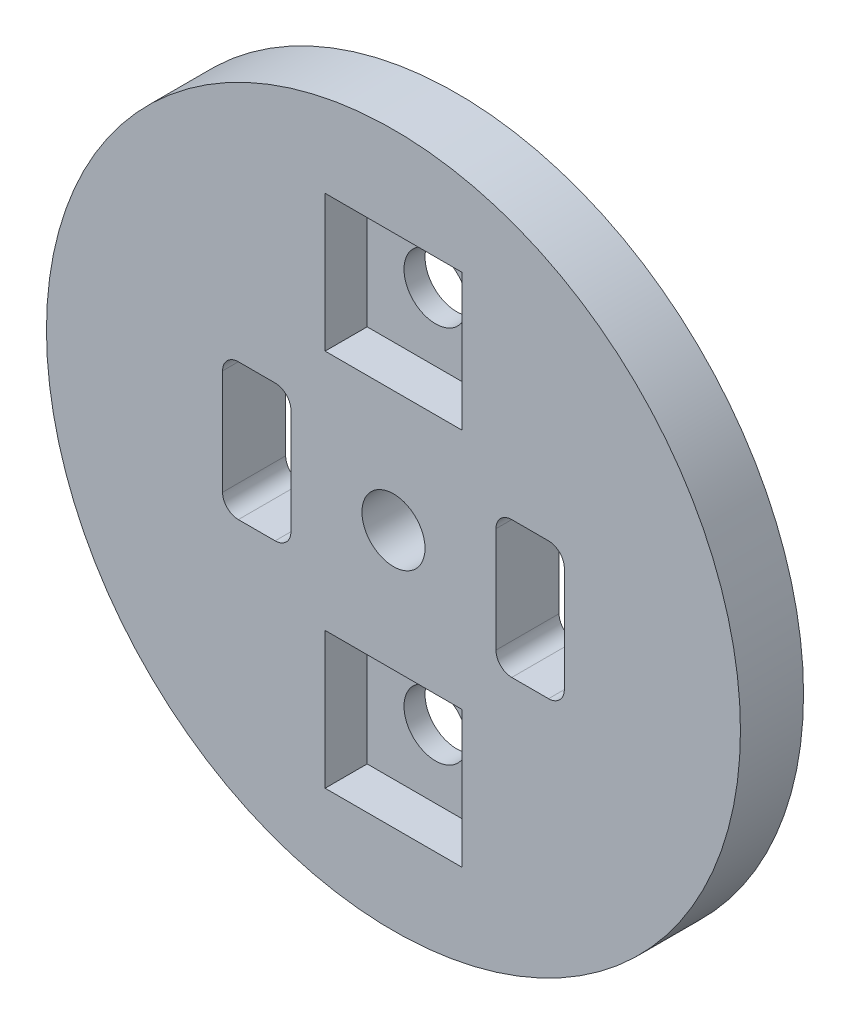
ISO-10303-21;
HEADER;
FILE_DESCRIPTION(('STEP AP214'),'2;1');
FILE_NAME('part.step','',(''),(''),'','','');
FILE_SCHEMA(('AUTOMOTIVE_DESIGN { 1 0 10303 214 1 1 1 1 }'));
ENDSEC;
DATA;
#1=APPLICATION_CONTEXT('core data for automotive mechanical design processes');
#2=APPLICATION_PROTOCOL_DEFINITION('international standard','automotive_design',2000,#1);
#3=PRODUCT_CONTEXT('',#1,'mechanical');
#4=PRODUCT('Part','Part','',(#3));
#5=PRODUCT_RELATED_PRODUCT_CATEGORY('part','',(#4));
#6=PRODUCT_DEFINITION_FORMATION('','',#4);
#7=PRODUCT_DEFINITION_CONTEXT('part definition',#1,'design');
#8=PRODUCT_DEFINITION('design','',#6,#7);
#9=PRODUCT_DEFINITION_SHAPE('','',#8);
#10=(LENGTH_UNIT() NAMED_UNIT(*) SI_UNIT(.MILLI.,.METRE.));
#11=(NAMED_UNIT(*) PLANE_ANGLE_UNIT() SI_UNIT($,.RADIAN.));
#12=(NAMED_UNIT(*) SI_UNIT($,.STERADIAN.) SOLID_ANGLE_UNIT());
#13=UNCERTAINTY_MEASURE_WITH_UNIT(LENGTH_MEASURE(1.E-05),#10,'distance_accuracy_value','');
#14=(GEOMETRIC_REPRESENTATION_CONTEXT(3) GLOBAL_UNCERTAINTY_ASSIGNED_CONTEXT((#13)) GLOBAL_UNIT_ASSIGNED_CONTEXT((#10,
#11,#12)) REPRESENTATION_CONTEXT('',''));
#15=CARTESIAN_POINT('',(0.,0.,0.));
#16=DIRECTION('',(0.,0.,1.));
#17=DIRECTION('',(1.,0.,0.));
#18=AXIS2_PLACEMENT_3D('',#15,#16,#17);
#19=CARTESIAN_POINT('',(215.7478079135,232.9520199932,3.));
#20=DIRECTION('',(0.,0.,-1.));
#21=DIRECTION('',(-1.,0.,0.));
#22=AXIS2_PLACEMENT_3D('',#19,#20,#21);
#23=CYLINDRICAL_SURFACE('',#22,1.5);
#24=CARTESIAN_POINT('',(215.7478079135,232.9520199932,0.));
#25=DIRECTION('',(0.,0.,1.));
#26=DIRECTION('',(1.,0.,0.));
#27=AXIS2_PLACEMENT_3D('',#24,#25,#26);
#28=CIRCLE('',#27,1.5);
#29=CARTESIAN_POINT('',(217.2478079135,232.9520199932,0.));
#30=VERTEX_POINT('',#29);
#31=EDGE_CURVE('E355',#30,#30,#28,.T.);
#32=ORIENTED_EDGE('',*,*,#31,.F.);
#33=EDGE_LOOP('',(#32));
#34=FACE_BOUND('',#33,.T.);
#35=CARTESIAN_POINT('',(215.7478079135,232.9520199932,1.));
#36=DIRECTION('',(0.,0.,1.));
#37=DIRECTION('',(1.,0.,0.));
#38=AXIS2_PLACEMENT_3D('',#35,#36,#37);
#39=CIRCLE('',#38,1.5);
#40=CARTESIAN_POINT('',(217.2478079135,232.9520199932,1.));
#41=VERTEX_POINT('',#40);
#42=EDGE_CURVE('E72',#41,#41,#39,.T.);
#43=ORIENTED_EDGE('',*,*,#42,.T.);
#44=EDGE_LOOP('',(#43));
#45=FACE_BOUND('',#44,.T.);
#46=ADVANCED_FACE('F69',(#34,#45),#23,.F.);
#47=CARTESIAN_POINT('',(215.7478079135,250.9520199932,3.));
#48=DIRECTION('',(0.,0.,-1.));
#49=DIRECTION('',(-1.,0.,0.));
#50=AXIS2_PLACEMENT_3D('',#47,#48,#49);
#51=CYLINDRICAL_SURFACE('',#50,1.5);
#52=CARTESIAN_POINT('',(215.7478079135,250.9520199932,0.));
#53=DIRECTION('',(0.,0.,1.));
#54=DIRECTION('',(1.,0.,0.));
#55=AXIS2_PLACEMENT_3D('',#52,#53,#54);
#56=CIRCLE('',#55,1.5);
#57=CARTESIAN_POINT('',(217.2478079135,250.9520199932,0.));
#58=VERTEX_POINT('',#57);
#59=EDGE_CURVE('E303',#58,#58,#56,.T.);
#60=ORIENTED_EDGE('',*,*,#59,.F.);
#61=EDGE_LOOP('',(#60));
#62=FACE_BOUND('',#61,.T.);
#63=CARTESIAN_POINT('',(215.7478079135,250.9520199932,1.));
#64=DIRECTION('',(0.,0.,1.));
#65=DIRECTION('',(1.,0.,0.));
#66=AXIS2_PLACEMENT_3D('',#63,#64,#65);
#67=CIRCLE('',#66,1.5);
#68=CARTESIAN_POINT('',(217.2478079135,250.9520199932,1.));
#69=VERTEX_POINT('',#68);
#70=EDGE_CURVE('E293',#69,#69,#67,.T.);
#71=ORIENTED_EDGE('',*,*,#70,.T.);
#72=EDGE_LOOP('',(#71));
#73=FACE_BOUND('',#72,.T.);
#74=ADVANCED_FACE('F440',(#62,#73),#51,.F.);
#75=CARTESIAN_POINT('',(215.7478079135,241.9520199932,3.));
#76=DIRECTION('',(0.,0.,-1.));
#77=DIRECTION('',(-1.,0.,0.));
#78=AXIS2_PLACEMENT_3D('',#75,#76,#77);
#79=CYLINDRICAL_SURFACE('',#78,16.5);
#80=CARTESIAN_POINT('',(215.7478079135,241.9520199932,3.));
#81=DIRECTION('',(0.,0.,1.));
#82=DIRECTION('',(1.,0.,0.));
#83=AXIS2_PLACEMENT_3D('',#80,#81,#82);
#84=CIRCLE('',#83,16.5);
#85=CARTESIAN_POINT('',(232.2478079135,241.9520199932,3.));
#86=VERTEX_POINT('',#85);
#87=EDGE_CURVE('E347',#86,#86,#84,.T.);
#88=ORIENTED_EDGE('',*,*,#87,.F.);
#89=EDGE_LOOP('',(#88));
#90=FACE_BOUND('',#89,.T.);
#91=CARTESIAN_POINT('',(215.7478079135,241.9520199932,0.));
#92=DIRECTION('',(0.,0.,1.));
#93=DIRECTION('',(1.,0.,0.));
#94=AXIS2_PLACEMENT_3D('',#91,#92,#93);
#95=CIRCLE('',#94,16.5);
#96=CARTESIAN_POINT('',(232.2478079135,241.9520199932,0.));
#97=VERTEX_POINT('',#96);
#98=EDGE_CURVE('E403',#97,#97,#95,.T.);
#99=ORIENTED_EDGE('',*,*,#98,.T.);
#100=EDGE_LOOP('',(#99));
#101=FACE_BOUND('',#100,.T.);
#102=ADVANCED_FACE('F477',(#90,#101),#79,.T.);
#103=CARTESIAN_POINT('',(0.,238.7020199932,3.));
#104=DIRECTION('',(0.,-1.,0.));
#105=DIRECTION('',(0.,0.,-1.));
#106=AXIS2_PLACEMENT_3D('',#103,#104,#105);
#107=PLANE('',#106);
#108=DIRECTION('',(-1.,0.,0.));
#109=VECTOR('',#108,1.);
#110=CARTESIAN_POINT('',(0.,238.7020199932,0.));
#111=LINE('',#110,#109);
#112=CARTESIAN_POINT('',(210.1228079135,238.7020199932,0.));
#113=VERTEX_POINT('',#112);
#114=CARTESIAN_POINT('',(208.3728079135,238.7020199932,0.));
#115=VERTEX_POINT('',#114);
#116=EDGE_CURVE('E382',#113,#115,#111,.T.);
#117=ORIENTED_EDGE('',*,*,#116,.T.);
#118=DIRECTION('',(0.,0.,-1.));
#119=VECTOR('',#118,1.);
#120=CARTESIAN_POINT('',(208.3728079135,238.7020199932,3.));
#121=LINE('',#120,#119);
#122=CARTESIAN_POINT('',(208.3728079135,238.7020199932,3.));
#123=VERTEX_POINT('',#122);
#124=EDGE_CURVE('E77',#123,#115,#121,.T.);
#125=ORIENTED_EDGE('',*,*,#124,.F.);
#126=DIRECTION('',(-1.,0.,0.));
#127=VECTOR('',#126,1.);
#128=CARTESIAN_POINT('',(0.,238.7020199932,3.));
#129=LINE('',#128,#127);
#130=CARTESIAN_POINT('',(210.1228079135,238.7020199932,3.));
#131=VERTEX_POINT('',#130);
#132=EDGE_CURVE('E330',#131,#123,#129,.T.);
#133=ORIENTED_EDGE('',*,*,#132,.F.);
#134=DIRECTION('',(0.,0.,-1.));
#135=VECTOR('',#134,1.);
#136=CARTESIAN_POINT('',(210.1228079135,238.7020199932,3.));
#137=LINE('',#136,#135);
#138=EDGE_CURVE('E12',#131,#113,#137,.T.);
#139=ORIENTED_EDGE('',*,*,#138,.T.);
#140=EDGE_LOOP('',(#117,#125,#133,#139));
#141=FACE_BOUND('',#140,.T.);
#142=ADVANCED_FACE('F480',(#141),#107,.F.);
#143=CARTESIAN_POINT('',(208.3728079135,239.4520199932,3.));
#144=DIRECTION('',(0.,0.,-1.));
#145=DIRECTION('',(-1.,0.,0.));
#146=AXIS2_PLACEMENT_3D('',#143,#144,#145);
#147=CYLINDRICAL_SURFACE('',#146,0.750000000000237);
#148=CARTESIAN_POINT('',(208.3728079135,239.4520199932,0.));
#149=DIRECTION('',(0.,0.,1.));
#150=DIRECTION('',(1.,0.,0.));
#151=AXIS2_PLACEMENT_3D('',#148,#149,#150);
#152=CIRCLE('',#151,0.750000000000237);
#153=CARTESIAN_POINT('',(207.6228079135,239.4520199932,0.));
#154=VERTEX_POINT('',#153);
#155=EDGE_CURVE('E385',#154,#115,#152,.T.);
#156=ORIENTED_EDGE('',*,*,#155,.F.);
#157=DIRECTION('',(0.,0.,-1.));
#158=VECTOR('',#157,1.);
#159=CARTESIAN_POINT('',(207.6228079135,239.4520199932,3.));
#160=LINE('',#159,#158);
#161=CARTESIAN_POINT('',(207.6228079135,239.4520199932,3.));
#162=VERTEX_POINT('',#161);
#163=EDGE_CURVE('E419',#162,#154,#160,.T.);
#164=ORIENTED_EDGE('',*,*,#163,.F.);
#165=CARTESIAN_POINT('',(208.3728079135,239.4520199932,3.));
#166=DIRECTION('',(0.,0.,1.));
#167=DIRECTION('',(1.,0.,0.));
#168=AXIS2_PLACEMENT_3D('',#165,#166,#167);
#169=CIRCLE('',#168,0.750000000000237);
#170=EDGE_CURVE('E332',#162,#123,#169,.T.);
#171=ORIENTED_EDGE('',*,*,#170,.T.);
#172=ORIENTED_EDGE('',*,*,#124,.T.);
#173=EDGE_LOOP('',(#156,#164,#171,#172));
#174=FACE_BOUND('',#173,.T.);
#175=ADVANCED_FACE('F546',(#174),#147,.F.);
#176=CARTESIAN_POINT('',(207.6228079135,0.,3.));
#177=DIRECTION('',(-1.,0.,0.));
#178=DIRECTION('',(0.,0.,1.));
#179=AXIS2_PLACEMENT_3D('',#176,#177,#178);
#180=PLANE('',#179);
#181=DIRECTION('',(0.,1.,0.));
#182=VECTOR('',#181,1.);
#183=CARTESIAN_POINT('',(207.6228079135,0.,0.));
#184=LINE('',#183,#182);
#185=CARTESIAN_POINT('',(207.6228079135,244.4520199932,0.));
#186=VERTEX_POINT('',#185);
#187=EDGE_CURVE('E388',#154,#186,#184,.T.);
#188=ORIENTED_EDGE('',*,*,#187,.T.);
#189=DIRECTION('',(0.,0.,-1.));
#190=VECTOR('',#189,1.);
#191=CARTESIAN_POINT('',(207.6228079135,244.4520199932,3.));
#192=LINE('',#191,#190);
#193=CARTESIAN_POINT('',(207.6228079135,244.4520199932,3.));
#194=VERTEX_POINT('',#193);
#195=EDGE_CURVE('E417',#194,#186,#192,.T.);
#196=ORIENTED_EDGE('',*,*,#195,.F.);
#197=DIRECTION('',(0.,1.,0.));
#198=VECTOR('',#197,1.);
#199=CARTESIAN_POINT('',(207.6228079135,0.,3.));
#200=LINE('',#199,#198);
#201=EDGE_CURVE('E335',#162,#194,#200,.T.);
#202=ORIENTED_EDGE('',*,*,#201,.F.);
#203=ORIENTED_EDGE('',*,*,#163,.T.);
#204=EDGE_LOOP('',(#188,#196,#202,#203));
#205=FACE_BOUND('',#204,.T.);
#206=ADVANCED_FACE('F542',(#205),#180,.F.);
#207=CARTESIAN_POINT('',(208.3728079135,244.4520199932,3.));
#208=DIRECTION('',(0.,0.,-1.));
#209=DIRECTION('',(-1.,0.,0.));
#210=AXIS2_PLACEMENT_3D('',#207,#208,#209);
#211=CYLINDRICAL_SURFACE('',#210,0.750000000000001);
#212=CARTESIAN_POINT('',(208.3728079135,244.4520199932,0.));
#213=DIRECTION('',(0.,0.,1.));
#214=DIRECTION('',(1.,0.,0.));
#215=AXIS2_PLACEMENT_3D('',#212,#213,#214);
#216=CIRCLE('',#215,0.750000000000001);
#217=CARTESIAN_POINT('',(208.3728079135,245.2020199932,0.));
#218=VERTEX_POINT('',#217);
#219=EDGE_CURVE('E391',#218,#186,#216,.T.);
#220=ORIENTED_EDGE('',*,*,#219,.F.);
#221=DIRECTION('',(0.,0.,-1.));
#222=VECTOR('',#221,1.);
#223=CARTESIAN_POINT('',(208.3728079135,245.2020199932,3.));
#224=LINE('',#223,#222);
#225=CARTESIAN_POINT('',(208.3728079135,245.2020199932,3.));
#226=VERTEX_POINT('',#225);
#227=EDGE_CURVE('E415',#226,#218,#224,.T.);
#228=ORIENTED_EDGE('',*,*,#227,.F.);
#229=CARTESIAN_POINT('',(208.3728079135,244.4520199932,3.));
#230=DIRECTION('',(0.,0.,1.));
#231=DIRECTION('',(1.,0.,0.));
#232=AXIS2_PLACEMENT_3D('',#229,#230,#231);
#233=CIRCLE('',#232,0.750000000000001);
#234=EDGE_CURVE('E337',#226,#194,#233,.T.);
#235=ORIENTED_EDGE('',*,*,#234,.T.);
#236=ORIENTED_EDGE('',*,*,#195,.T.);
#237=EDGE_LOOP('',(#220,#228,#235,#236));
#238=FACE_BOUND('',#237,.T.);
#239=ADVANCED_FACE('F538',(#238),#211,.F.);
#240=CARTESIAN_POINT('',(0.,245.2020199932,3.));
#241=DIRECTION('',(0.,1.,0.));
#242=DIRECTION('',(0.,0.,1.));
#243=AXIS2_PLACEMENT_3D('',#240,#241,#242);
#244=PLANE('',#243);
#245=DIRECTION('',(1.,0.,0.));
#246=VECTOR('',#245,1.);
#247=CARTESIAN_POINT('',(0.,245.2020199932,0.));
#248=LINE('',#247,#246);
#249=CARTESIAN_POINT('',(210.1228079135,245.2020199932,0.));
#250=VERTEX_POINT('',#249);
#251=EDGE_CURVE('E394',#218,#250,#248,.T.);
#252=ORIENTED_EDGE('',*,*,#251,.T.);
#253=DIRECTION('',(0.,0.,-1.));
#254=VECTOR('',#253,1.);
#255=CARTESIAN_POINT('',(210.1228079135,245.2020199932,3.));
#256=LINE('',#255,#254);
#257=CARTESIAN_POINT('',(210.1228079135,245.2020199932,3.));
#258=VERTEX_POINT('',#257);
#259=EDGE_CURVE('E413',#258,#250,#256,.T.);
#260=ORIENTED_EDGE('',*,*,#259,.F.);
#261=DIRECTION('',(1.,0.,0.));
#262=VECTOR('',#261,1.);
#263=CARTESIAN_POINT('',(0.,245.2020199932,3.));
#264=LINE('',#263,#262);
#265=EDGE_CURVE('E340',#226,#258,#264,.T.);
#266=ORIENTED_EDGE('',*,*,#265,.F.);
#267=ORIENTED_EDGE('',*,*,#227,.T.);
#268=EDGE_LOOP('',(#252,#260,#266,#267));
#269=FACE_BOUND('',#268,.T.);
#270=ADVANCED_FACE('F534',(#269),#244,.F.);
#271=CARTESIAN_POINT('',(210.1228079135,244.4520199932,3.));
#272=DIRECTION('',(0.,0.,-1.));
#273=DIRECTION('',(-1.,0.,0.));
#274=AXIS2_PLACEMENT_3D('',#271,#272,#273);
#275=CYLINDRICAL_SURFACE('',#274,0.750000000000001);
#276=CARTESIAN_POINT('',(210.1228079135,244.4520199932,0.));
#277=DIRECTION('',(0.,0.,1.));
#278=DIRECTION('',(1.,0.,0.));
#279=AXIS2_PLACEMENT_3D('',#276,#277,#278);
#280=CIRCLE('',#279,0.750000000000001);
#281=CARTESIAN_POINT('',(210.8728079135,244.4520199932,0.));
#282=VERTEX_POINT('',#281);
#283=EDGE_CURVE('E397',#282,#250,#280,.T.);
#284=ORIENTED_EDGE('',*,*,#283,.F.);
#285=DIRECTION('',(0.,0.,-1.));
#286=VECTOR('',#285,1.);
#287=CARTESIAN_POINT('',(210.8728079135,244.4520199932,3.));
#288=LINE('',#287,#286);
#289=CARTESIAN_POINT('',(210.8728079135,244.4520199932,3.));
#290=VERTEX_POINT('',#289);
#291=EDGE_CURVE('E410',#290,#282,#288,.T.);
#292=ORIENTED_EDGE('',*,*,#291,.F.);
#293=CARTESIAN_POINT('',(210.1228079135,244.4520199932,3.));
#294=DIRECTION('',(0.,0.,1.));
#295=DIRECTION('',(1.,0.,0.));
#296=AXIS2_PLACEMENT_3D('',#293,#294,#295);
#297=CIRCLE('',#296,0.750000000000001);
#298=EDGE_CURVE('E342',#290,#258,#297,.T.);
#299=ORIENTED_EDGE('',*,*,#298,.T.);
#300=ORIENTED_EDGE('',*,*,#259,.T.);
#301=EDGE_LOOP('',(#284,#292,#299,#300));
#302=FACE_BOUND('',#301,.T.);
#303=ADVANCED_FACE('F530',(#302),#275,.F.);
#304=CARTESIAN_POINT('',(210.8728079135,0.,3.));
#305=DIRECTION('',(1.,0.,0.));
#306=DIRECTION('',(0.,0.,-1.));
#307=AXIS2_PLACEMENT_3D('',#304,#305,#306);
#308=PLANE('',#307);
#309=DIRECTION('',(0.,-1.,0.));
#310=VECTOR('',#309,1.);
#311=CARTESIAN_POINT('',(210.8728079135,0.,0.));
#312=LINE('',#311,#310);
#313=CARTESIAN_POINT('',(210.8728079135,239.4520199932,0.));
#314=VERTEX_POINT('',#313);
#315=EDGE_CURVE('E400',#282,#314,#312,.T.);
#316=ORIENTED_EDGE('',*,*,#315,.T.);
#317=DIRECTION('',(0.,0.,-1.));
#318=VECTOR('',#317,1.);
#319=CARTESIAN_POINT('',(210.8728079135,239.4520199932,3.));
#320=LINE('',#319,#318);
#321=CARTESIAN_POINT('',(210.8728079135,239.4520199932,3.));
#322=VERTEX_POINT('',#321);
#323=EDGE_CURVE('E408',#322,#314,#320,.T.);
#324=ORIENTED_EDGE('',*,*,#323,.F.);
#325=DIRECTION('',(0.,-1.,0.));
#326=VECTOR('',#325,1.);
#327=CARTESIAN_POINT('',(210.8728079135,0.,3.));
#328=LINE('',#327,#326);
#329=EDGE_CURVE('E345',#290,#322,#328,.T.);
#330=ORIENTED_EDGE('',*,*,#329,.F.);
#331=ORIENTED_EDGE('',*,*,#291,.T.);
#332=EDGE_LOOP('',(#316,#324,#330,#331));
#333=FACE_BOUND('',#332,.T.);
#334=ADVANCED_FACE('F526',(#333),#308,.F.);
#335=CARTESIAN_POINT('',(210.1228079135,239.4520199932,3.));
#336=DIRECTION('',(0.,0.,-1.));
#337=DIRECTION('',(-1.,0.,0.));
#338=AXIS2_PLACEMENT_3D('',#335,#336,#337);
#339=CYLINDRICAL_SURFACE('',#338,0.750000000000001);
#340=CARTESIAN_POINT('',(210.1228079135,239.4520199932,0.));
#341=DIRECTION('',(0.,0.,1.));
#342=DIRECTION('',(1.,0.,0.));
#343=AXIS2_PLACEMENT_3D('',#340,#341,#342);
#344=CIRCLE('',#343,0.750000000000001);
#345=EDGE_CURVE('E379',#113,#314,#344,.T.);
#346=ORIENTED_EDGE('',*,*,#345,.F.);
#347=ORIENTED_EDGE('',*,*,#138,.F.);
#348=CARTESIAN_POINT('',(210.1228079135,239.4520199932,3.));
#349=DIRECTION('',(0.,0.,1.));
#350=DIRECTION('',(1.,0.,0.));
#351=AXIS2_PLACEMENT_3D('',#348,#349,#350);
#352=CIRCLE('',#351,0.750000000000001);
#353=EDGE_CURVE('E327',#131,#322,#352,.T.);
#354=ORIENTED_EDGE('',*,*,#353,.T.);
#355=ORIENTED_EDGE('',*,*,#323,.T.);
#356=EDGE_LOOP('',(#346,#347,#354,#355));
#357=FACE_BOUND('',#356,.T.);
#358=ADVANCED_FACE('F529',(#357),#339,.F.);
#359=CARTESIAN_POINT('',(220.6228079135,0.,3.));
#360=DIRECTION('',(1.,0.,0.));
#361=DIRECTION('',(0.,0.,-1.));
#362=AXIS2_PLACEMENT_3D('',#359,#360,#361);
#363=PLANE('',#362);
#364=DIRECTION('',(0.,-1.,0.));
#365=VECTOR('',#364,1.);
#366=CARTESIAN_POINT('',(220.6228079135,0.,0.));
#367=LINE('',#366,#365);
#368=CARTESIAN_POINT('',(220.6228079135,244.4520199932,0.));
#369=VERTEX_POINT('',#368);
#370=CARTESIAN_POINT('',(220.6228079135,239.4520199932,0.));
#371=VERTEX_POINT('',#370);
#372=EDGE_CURVE('E358',#369,#371,#367,.T.);
#373=ORIENTED_EDGE('',*,*,#372,.F.);
#374=DIRECTION('',(0.,0.,-1.));
#375=VECTOR('',#374,1.);
#376=CARTESIAN_POINT('',(220.6228079135,244.4520199932,3.));
#377=LINE('',#376,#375);
#378=CARTESIAN_POINT('',(220.6228079135,244.4520199932,3.));
#379=VERTEX_POINT('',#378);
#380=EDGE_CURVE('E433',#379,#369,#377,.T.);
#381=ORIENTED_EDGE('',*,*,#380,.F.);
#382=DIRECTION('',(0.,-1.,0.));
#383=VECTOR('',#382,1.);
#384=CARTESIAN_POINT('',(220.6228079135,0.,3.));
#385=LINE('',#384,#383);
#386=CARTESIAN_POINT('',(220.6228079135,239.4520199932,3.));
#387=VERTEX_POINT('',#386);
#388=EDGE_CURVE('E306',#379,#387,#385,.T.);
#389=ORIENTED_EDGE('',*,*,#388,.T.);
#390=DIRECTION('',(0.,0.,-1.));
#391=VECTOR('',#390,1.);
#392=CARTESIAN_POINT('',(220.6228079135,239.4520199932,3.));
#393=LINE('',#392,#391);
#394=EDGE_CURVE('E411',#387,#371,#393,.T.);
#395=ORIENTED_EDGE('',*,*,#394,.T.);
#396=EDGE_LOOP('',(#373,#381,#389,#395));
#397=FACE_BOUND('',#396,.T.);
#398=ADVANCED_FACE('F556',(#397),#363,.T.);
#399=CARTESIAN_POINT('',(221.3728079135,244.4520199932,3.));
#400=DIRECTION('',(0.,0.,-1.));
#401=DIRECTION('',(-1.,0.,0.));
#402=AXIS2_PLACEMENT_3D('',#399,#400,#401);
#403=CYLINDRICAL_SURFACE('',#402,0.750000000000001);
#404=CARTESIAN_POINT('',(221.3728079135,244.4520199932,0.));
#405=DIRECTION('',(0.,0.,1.));
#406=DIRECTION('',(1.,0.,0.));
#407=AXIS2_PLACEMENT_3D('',#404,#405,#406);
#408=CIRCLE('',#407,0.750000000000001);
#409=CARTESIAN_POINT('',(221.3728079135,245.2020199932,0.));
#410=VERTEX_POINT('',#409);
#411=EDGE_CURVE('E361',#410,#369,#408,.T.);
#412=ORIENTED_EDGE('',*,*,#411,.F.);
#413=DIRECTION('',(0.,0.,-1.));
#414=VECTOR('',#413,1.);
#415=CARTESIAN_POINT('',(221.3728079135,245.2020199932,3.));
#416=LINE('',#415,#414);
#417=CARTESIAN_POINT('',(221.3728079135,245.2020199932,3.));
#418=VERTEX_POINT('',#417);
#419=EDGE_CURVE('E431',#418,#410,#416,.T.);
#420=ORIENTED_EDGE('',*,*,#419,.F.);
#421=CARTESIAN_POINT('',(221.3728079135,244.4520199932,3.));
#422=DIRECTION('',(0.,0.,1.));
#423=DIRECTION('',(1.,0.,0.));
#424=AXIS2_PLACEMENT_3D('',#421,#422,#423);
#425=CIRCLE('',#424,0.750000000000001);
#426=EDGE_CURVE('E309',#418,#379,#425,.T.);
#427=ORIENTED_EDGE('',*,*,#426,.T.);
#428=ORIENTED_EDGE('',*,*,#380,.T.);
#429=EDGE_LOOP('',(#412,#420,#427,#428));
#430=FACE_BOUND('',#429,.T.);
#431=ADVANCED_FACE('F578',(#430),#403,.F.);
#432=CARTESIAN_POINT('',(0.,245.2020199932,3.));
#433=DIRECTION('',(0.,-1.,0.));
#434=DIRECTION('',(0.,0.,-1.));
#435=AXIS2_PLACEMENT_3D('',#432,#433,#434);
#436=PLANE('',#435);
#437=DIRECTION('',(-1.,0.,0.));
#438=VECTOR('',#437,1.);
#439=CARTESIAN_POINT('',(0.,245.2020199932,0.));
#440=LINE('',#439,#438);
#441=CARTESIAN_POINT('',(223.1228079135,245.2020199932,0.));
#442=VERTEX_POINT('',#441);
#443=EDGE_CURVE('E364',#442,#410,#440,.T.);
#444=ORIENTED_EDGE('',*,*,#443,.F.);
#445=DIRECTION('',(0.,0.,-1.));
#446=VECTOR('',#445,1.);
#447=CARTESIAN_POINT('',(223.1228079135,245.2020199932,3.));
#448=LINE('',#447,#446);
#449=CARTESIAN_POINT('',(223.1228079135,245.2020199932,3.));
#450=VERTEX_POINT('',#449);
#451=EDGE_CURVE('E429',#450,#442,#448,.T.);
#452=ORIENTED_EDGE('',*,*,#451,.F.);
#453=DIRECTION('',(-1.,0.,0.));
#454=VECTOR('',#453,1.);
#455=CARTESIAN_POINT('',(0.,245.2020199932,3.));
#456=LINE('',#455,#454);
#457=EDGE_CURVE('E312',#450,#418,#456,.T.);
#458=ORIENTED_EDGE('',*,*,#457,.T.);
#459=ORIENTED_EDGE('',*,*,#419,.T.);
#460=EDGE_LOOP('',(#444,#452,#458,#459));
#461=FACE_BOUND('',#460,.T.);
#462=ADVANCED_FACE('F574',(#461),#436,.T.);
#463=CARTESIAN_POINT('',(223.1228079135,244.4520199932,3.));
#464=DIRECTION('',(0.,0.,-1.));
#465=DIRECTION('',(-1.,0.,0.));
#466=AXIS2_PLACEMENT_3D('',#463,#464,#465);
#467=CYLINDRICAL_SURFACE('',#466,0.750000000000001);
#468=CARTESIAN_POINT('',(223.1228079135,244.4520199932,0.));
#469=DIRECTION('',(0.,0.,1.));
#470=DIRECTION('',(1.,0.,0.));
#471=AXIS2_PLACEMENT_3D('',#468,#469,#470);
#472=CIRCLE('',#471,0.750000000000001);
#473=CARTESIAN_POINT('',(223.8728079135,244.4520199932,0.));
#474=VERTEX_POINT('',#473);
#475=EDGE_CURVE('E367',#474,#442,#472,.T.);
#476=ORIENTED_EDGE('',*,*,#475,.F.);
#477=DIRECTION('',(0.,0.,-1.));
#478=VECTOR('',#477,1.);
#479=CARTESIAN_POINT('',(223.8728079135,244.4520199932,3.));
#480=LINE('',#479,#478);
#481=CARTESIAN_POINT('',(223.8728079135,244.4520199932,3.));
#482=VERTEX_POINT('',#481);
#483=EDGE_CURVE('E427',#482,#474,#480,.T.);
#484=ORIENTED_EDGE('',*,*,#483,.F.);
#485=CARTESIAN_POINT('',(223.1228079135,244.4520199932,3.));
#486=DIRECTION('',(0.,0.,1.));
#487=DIRECTION('',(1.,0.,0.));
#488=AXIS2_PLACEMENT_3D('',#485,#486,#487);
#489=CIRCLE('',#488,0.750000000000001);
#490=EDGE_CURVE('E315',#482,#450,#489,.T.);
#491=ORIENTED_EDGE('',*,*,#490,.T.);
#492=ORIENTED_EDGE('',*,*,#451,.T.);
#493=EDGE_LOOP('',(#476,#484,#491,#492));
#494=FACE_BOUND('',#493,.T.);
#495=ADVANCED_FACE('F570',(#494),#467,.F.);
#496=CARTESIAN_POINT('',(223.8728079135,0.,3.));
#497=DIRECTION('',(-1.,0.,0.));
#498=DIRECTION('',(0.,0.,1.));
#499=AXIS2_PLACEMENT_3D('',#496,#497,#498);
#500=PLANE('',#499);
#501=DIRECTION('',(0.,1.,0.));
#502=VECTOR('',#501,1.);
#503=CARTESIAN_POINT('',(223.8728079135,0.,0.));
#504=LINE('',#503,#502);
#505=CARTESIAN_POINT('',(223.8728079135,239.4520199932,0.));
#506=VERTEX_POINT('',#505);
#507=EDGE_CURVE('E370',#506,#474,#504,.T.);
#508=ORIENTED_EDGE('',*,*,#507,.F.);
#509=DIRECTION('',(0.,0.,-1.));
#510=VECTOR('',#509,1.);
#511=CARTESIAN_POINT('',(223.8728079135,239.4520199932,3.));
#512=LINE('',#511,#510);
#513=CARTESIAN_POINT('',(223.8728079135,239.4520199932,3.));
#514=VERTEX_POINT('',#513);
#515=EDGE_CURVE('E425',#514,#506,#512,.T.);
#516=ORIENTED_EDGE('',*,*,#515,.F.);
#517=DIRECTION('',(0.,1.,0.));
#518=VECTOR('',#517,1.);
#519=CARTESIAN_POINT('',(223.8728079135,0.,3.));
#520=LINE('',#519,#518);
#521=EDGE_CURVE('E318',#514,#482,#520,.T.);
#522=ORIENTED_EDGE('',*,*,#521,.T.);
#523=ORIENTED_EDGE('',*,*,#483,.T.);
#524=EDGE_LOOP('',(#508,#516,#522,#523));
#525=FACE_BOUND('',#524,.T.);
#526=ADVANCED_FACE('F566',(#525),#500,.T.);
#527=CARTESIAN_POINT('',(223.1228079135,239.4520199932,3.));
#528=DIRECTION('',(0.,0.,-1.));
#529=DIRECTION('',(-1.,0.,0.));
#530=AXIS2_PLACEMENT_3D('',#527,#528,#529);
#531=CYLINDRICAL_SURFACE('',#530,0.750000000000001);
#532=CARTESIAN_POINT('',(223.1228079135,239.4520199932,0.));
#533=DIRECTION('',(0.,0.,1.));
#534=DIRECTION('',(1.,0.,0.));
#535=AXIS2_PLACEMENT_3D('',#532,#533,#534);
#536=CIRCLE('',#535,0.750000000000001);
#537=CARTESIAN_POINT('',(223.1228079135,238.7020199932,0.));
#538=VERTEX_POINT('',#537);
#539=EDGE_CURVE('E373',#538,#506,#536,.T.);
#540=ORIENTED_EDGE('',*,*,#539,.F.);
#541=DIRECTION('',(0.,0.,-1.));
#542=VECTOR('',#541,1.);
#543=CARTESIAN_POINT('',(223.1228079135,238.7020199932,3.));
#544=LINE('',#543,#542);
#545=CARTESIAN_POINT('',(223.1228079135,238.7020199932,3.));
#546=VERTEX_POINT('',#545);
#547=EDGE_CURVE('E423',#546,#538,#544,.T.);
#548=ORIENTED_EDGE('',*,*,#547,.F.);
#549=CARTESIAN_POINT('',(223.1228079135,239.4520199932,3.));
#550=DIRECTION('',(0.,0.,1.));
#551=DIRECTION('',(1.,0.,0.));
#552=AXIS2_PLACEMENT_3D('',#549,#550,#551);
#553=CIRCLE('',#552,0.750000000000001);
#554=EDGE_CURVE('E321',#546,#514,#553,.T.);
#555=ORIENTED_EDGE('',*,*,#554,.T.);
#556=ORIENTED_EDGE('',*,*,#515,.T.);
#557=EDGE_LOOP('',(#540,#548,#555,#556));
#558=FACE_BOUND('',#557,.T.);
#559=ADVANCED_FACE('F562',(#558),#531,.F.);
#560=CARTESIAN_POINT('',(0.,238.7020199932,3.));
#561=DIRECTION('',(0.,1.,0.));
#562=DIRECTION('',(0.,0.,1.));
#563=AXIS2_PLACEMENT_3D('',#560,#561,#562);
#564=PLANE('',#563);
#565=DIRECTION('',(1.,0.,0.));
#566=VECTOR('',#565,1.);
#567=CARTESIAN_POINT('',(0.,238.7020199932,0.));
#568=LINE('',#567,#566);
#569=CARTESIAN_POINT('',(221.3728079135,238.7020199932,0.));
#570=VERTEX_POINT('',#569);
#571=EDGE_CURVE('E376',#570,#538,#568,.T.);
#572=ORIENTED_EDGE('',*,*,#571,.F.);
#573=DIRECTION('',(0.,0.,-1.));
#574=VECTOR('',#573,1.);
#575=CARTESIAN_POINT('',(221.3728079135,238.7020199932,3.));
#576=LINE('',#575,#574);
#577=CARTESIAN_POINT('',(221.3728079135,238.7020199932,3.));
#578=VERTEX_POINT('',#577);
#579=EDGE_CURVE('E350',#578,#570,#576,.T.);
#580=ORIENTED_EDGE('',*,*,#579,.F.);
#581=DIRECTION('',(1.,0.,0.));
#582=VECTOR('',#581,1.);
#583=CARTESIAN_POINT('',(0.,238.7020199932,3.));
#584=LINE('',#583,#582);
#585=EDGE_CURVE('E324',#578,#546,#584,.T.);
#586=ORIENTED_EDGE('',*,*,#585,.T.);
#587=ORIENTED_EDGE('',*,*,#547,.T.);
#588=EDGE_LOOP('',(#572,#580,#586,#587));
#589=FACE_BOUND('',#588,.T.);
#590=ADVANCED_FACE('F558',(#589),#564,.T.);
#591=CARTESIAN_POINT('',(221.3728079135,239.4520199932,3.));
#592=DIRECTION('',(0.,0.,-1.));
#593=DIRECTION('',(-1.,0.,0.));
#594=AXIS2_PLACEMENT_3D('',#591,#592,#593);
#595=CYLINDRICAL_SURFACE('',#594,0.750000000000001);
#596=CARTESIAN_POINT('',(221.3728079135,239.4520199932,0.));
#597=DIRECTION('',(0.,0.,1.));
#598=DIRECTION('',(1.,0.,0.));
#599=AXIS2_PLACEMENT_3D('',#596,#597,#598);
#600=CIRCLE('',#599,0.750000000000001);
#601=EDGE_CURVE('E354',#371,#570,#600,.T.);
#602=ORIENTED_EDGE('',*,*,#601,.F.);
#603=ORIENTED_EDGE('',*,*,#394,.F.);
#604=CARTESIAN_POINT('',(221.3728079135,239.4520199932,3.));
#605=DIRECTION('',(0.,0.,1.));
#606=DIRECTION('',(1.,0.,0.));
#607=AXIS2_PLACEMENT_3D('',#604,#605,#606);
#608=CIRCLE('',#607,0.750000000000001);
#609=EDGE_CURVE('E302',#387,#578,#608,.T.);
#610=ORIENTED_EDGE('',*,*,#609,.T.);
#611=ORIENTED_EDGE('',*,*,#579,.T.);
#612=EDGE_LOOP('',(#602,#603,#610,#611));
#613=FACE_BOUND('',#612,.T.);
#614=ADVANCED_FACE('F561',(#613),#595,.F.);
#615=CARTESIAN_POINT('',(215.7478079135,241.9520199932,3.));
#616=DIRECTION('',(0.,0.,-1.));
#617=DIRECTION('',(-1.,0.,0.));
#618=AXIS2_PLACEMENT_3D('',#615,#616,#617);
#619=CYLINDRICAL_SURFACE('',#618,1.5);
#620=CARTESIAN_POINT('',(215.7478079135,241.9520199932,3.));
#621=DIRECTION('',(0.,0.,1.));
#622=DIRECTION('',(1.,0.,0.));
#623=AXIS2_PLACEMENT_3D('',#620,#621,#622);
#624=CIRCLE('',#623,1.5);
#625=CARTESIAN_POINT('',(217.2478079135,241.9520199932,3.));
#626=VERTEX_POINT('',#625);
#627=EDGE_CURVE('E299',#626,#626,#624,.T.);
#628=ORIENTED_EDGE('',*,*,#627,.T.);
#629=EDGE_LOOP('',(#628));
#630=FACE_BOUND('',#629,.T.);
#631=CARTESIAN_POINT('',(215.7478079135,241.9520199932,0.));
#632=DIRECTION('',(0.,0.,1.));
#633=DIRECTION('',(1.,0.,0.));
#634=AXIS2_PLACEMENT_3D('',#631,#632,#633);
#635=CIRCLE('',#634,1.5);
#636=CARTESIAN_POINT('',(217.2478079135,241.9520199932,0.));
#637=VERTEX_POINT('',#636);
#638=EDGE_CURVE('E351',#637,#637,#635,.T.);
#639=ORIENTED_EDGE('',*,*,#638,.F.);
#640=EDGE_LOOP('',(#639));
#641=FACE_BOUND('',#640,.T.);
#642=ADVANCED_FACE('F486',(#630,#641),#619,.F.);
#643=CARTESIAN_POINT('',(0.,0.,0.));
#644=DIRECTION('',(0.,0.,1.));
#645=DIRECTION('',(1.,0.,0.));
#646=AXIS2_PLACEMENT_3D('',#643,#644,#645);
#647=PLANE('',#646);
#648=ORIENTED_EDGE('',*,*,#638,.T.);
#649=EDGE_LOOP('',(#648));
#650=FACE_BOUND('',#649,.T.);
#651=ORIENTED_EDGE('',*,*,#601,.T.);
#652=ORIENTED_EDGE('',*,*,#571,.T.);
#653=ORIENTED_EDGE('',*,*,#539,.T.);
#654=ORIENTED_EDGE('',*,*,#507,.T.);
#655=ORIENTED_EDGE('',*,*,#475,.T.);
#656=ORIENTED_EDGE('',*,*,#443,.T.);
#657=ORIENTED_EDGE('',*,*,#411,.T.);
#658=ORIENTED_EDGE('',*,*,#372,.T.);
#659=EDGE_LOOP('',(#651,#652,#653,#654,#655,#656,#657,#658));
#660=FACE_BOUND('',#659,.T.);
#661=ORIENTED_EDGE('',*,*,#345,.T.);
#662=ORIENTED_EDGE('',*,*,#315,.F.);
#663=ORIENTED_EDGE('',*,*,#283,.T.);
#664=ORIENTED_EDGE('',*,*,#251,.F.);
#665=ORIENTED_EDGE('',*,*,#219,.T.);
#666=ORIENTED_EDGE('',*,*,#187,.F.);
#667=ORIENTED_EDGE('',*,*,#155,.T.);
#668=ORIENTED_EDGE('',*,*,#116,.F.);
#669=EDGE_LOOP('',(#661,#662,#663,#664,#665,#666,#667,#668));
#670=FACE_BOUND('',#669,.T.);
#671=ORIENTED_EDGE('',*,*,#98,.F.);
#672=EDGE_LOOP('',(#671));
#673=FACE_BOUND('',#672,.T.);
#674=ORIENTED_EDGE('',*,*,#59,.T.);
#675=EDGE_LOOP('',(#674));
#676=FACE_BOUND('',#675,.T.);
#677=ORIENTED_EDGE('',*,*,#31,.T.);
#678=EDGE_LOOP('',(#677));
#679=FACE_BOUND('',#678,.T.);
#680=ADVANCED_FACE('F464',(#650,#660,#670,#673,#676,#679),#647,.F.);
#681=CARTESIAN_POINT('',(0.,0.,3.));
#682=DIRECTION('',(0.,0.,1.));
#683=DIRECTION('',(1.,0.,0.));
#684=AXIS2_PLACEMENT_3D('',#681,#682,#683);
#685=PLANE('',#684);
#686=DIRECTION('',(0.,1.,0.));
#687=VECTOR('',#686,1.);
#688=CARTESIAN_POINT('',(218.9978079135,236.2020199932,3.));
#689=LINE('',#688,#687);
#690=CARTESIAN_POINT('',(218.9978079135,229.7020199932,3.));
#691=VERTEX_POINT('',#690);
#692=CARTESIAN_POINT('',(218.9978079135,236.2020199932,3.));
#693=VERTEX_POINT('',#692);
#694=EDGE_CURVE('E85',#691,#693,#689,.T.);
#695=ORIENTED_EDGE('',*,*,#694,.F.);
#696=DIRECTION('',(1.,0.,0.));
#697=VECTOR('',#696,1.);
#698=CARTESIAN_POINT('',(212.4978079135,229.7020199932,3.));
#699=LINE('',#698,#697);
#700=CARTESIAN_POINT('',(212.4978079135,229.7020199932,3.));
#701=VERTEX_POINT('',#700);
#702=EDGE_CURVE('E250',#701,#691,#699,.T.);
#703=ORIENTED_EDGE('',*,*,#702,.F.);
#704=DIRECTION('',(0.,-1.,0.));
#705=VECTOR('',#704,1.);
#706=CARTESIAN_POINT('',(212.4978079135,236.2020199932,3.));
#707=LINE('',#706,#705);
#708=CARTESIAN_POINT('',(212.4978079135,236.2020199932,3.));
#709=VERTEX_POINT('',#708);
#710=EDGE_CURVE('E253',#709,#701,#707,.T.);
#711=ORIENTED_EDGE('',*,*,#710,.F.);
#712=DIRECTION('',(-1.,0.,0.));
#713=VECTOR('',#712,1.);
#714=CARTESIAN_POINT('',(212.4978079135,236.2020199932,3.));
#715=LINE('',#714,#713);
#716=EDGE_CURVE('E259',#693,#709,#715,.T.);
#717=ORIENTED_EDGE('',*,*,#716,.F.);
#718=EDGE_LOOP('',(#695,#703,#711,#717));
#719=FACE_BOUND('',#718,.T.);
#720=DIRECTION('',(0.,1.,0.));
#721=VECTOR('',#720,1.);
#722=CARTESIAN_POINT('',(218.9978079135,254.2020199932,3.));
#723=LINE('',#722,#721);
#724=CARTESIAN_POINT('',(218.9978079135,247.7020199932,3.));
#725=VERTEX_POINT('',#724);
#726=CARTESIAN_POINT('',(218.9978079135,254.2020199932,3.));
#727=VERTEX_POINT('',#726);
#728=EDGE_CURVE('E93',#725,#727,#723,.T.);
#729=ORIENTED_EDGE('',*,*,#728,.F.);
#730=DIRECTION('',(1.,0.,0.));
#731=VECTOR('',#730,1.);
#732=CARTESIAN_POINT('',(212.4978079135,247.7020199932,3.));
#733=LINE('',#732,#731);
#734=CARTESIAN_POINT('',(212.4978079135,247.7020199932,3.));
#735=VERTEX_POINT('',#734);
#736=EDGE_CURVE('E272',#735,#725,#733,.T.);
#737=ORIENTED_EDGE('',*,*,#736,.F.);
#738=DIRECTION('',(0.,-1.,0.));
#739=VECTOR('',#738,1.);
#740=CARTESIAN_POINT('',(212.4978079135,254.2020199932,3.));
#741=LINE('',#740,#739);
#742=CARTESIAN_POINT('',(212.4978079135,254.2020199932,3.));
#743=VERTEX_POINT('',#742);
#744=EDGE_CURVE('E286',#743,#735,#741,.T.);
#745=ORIENTED_EDGE('',*,*,#744,.F.);
#746=DIRECTION('',(-1.,0.,0.));
#747=VECTOR('',#746,1.);
#748=CARTESIAN_POINT('',(212.4978079135,254.2020199932,3.));
#749=LINE('',#748,#747);
#750=EDGE_CURVE('E283',#727,#743,#749,.T.);
#751=ORIENTED_EDGE('',*,*,#750,.F.);
#752=EDGE_LOOP('',(#729,#737,#745,#751));
#753=FACE_BOUND('',#752,.T.);
#754=ORIENTED_EDGE('',*,*,#627,.F.);
#755=EDGE_LOOP('',(#754));
#756=FACE_BOUND('',#755,.T.);
#757=ORIENTED_EDGE('',*,*,#609,.F.);
#758=ORIENTED_EDGE('',*,*,#388,.F.);
#759=ORIENTED_EDGE('',*,*,#426,.F.);
#760=ORIENTED_EDGE('',*,*,#457,.F.);
#761=ORIENTED_EDGE('',*,*,#490,.F.);
#762=ORIENTED_EDGE('',*,*,#521,.F.);
#763=ORIENTED_EDGE('',*,*,#554,.F.);
#764=ORIENTED_EDGE('',*,*,#585,.F.);
#765=EDGE_LOOP('',(#757,#758,#759,#760,#761,#762,#763,#764));
#766=FACE_BOUND('',#765,.T.);
#767=ORIENTED_EDGE('',*,*,#353,.F.);
#768=ORIENTED_EDGE('',*,*,#132,.T.);
#769=ORIENTED_EDGE('',*,*,#170,.F.);
#770=ORIENTED_EDGE('',*,*,#201,.T.);
#771=ORIENTED_EDGE('',*,*,#234,.F.);
#772=ORIENTED_EDGE('',*,*,#265,.T.);
#773=ORIENTED_EDGE('',*,*,#298,.F.);
#774=ORIENTED_EDGE('',*,*,#329,.T.);
#775=EDGE_LOOP('',(#767,#768,#769,#770,#771,#772,#773,#774));
#776=FACE_BOUND('',#775,.T.);
#777=ORIENTED_EDGE('',*,*,#87,.T.);
#778=EDGE_LOOP('',(#777));
#779=FACE_BOUND('',#778,.T.);
#780=ADVANCED_FACE('F461',(#719,#753,#756,#766,#776,#779),#685,.T.);
#781=CARTESIAN_POINT('',(218.9978079135,254.2020199932,1.));
#782=DIRECTION('',(1.,0.,0.));
#783=DIRECTION('',(0.,0.,-1.));
#784=AXIS2_PLACEMENT_3D('',#781,#782,#783);
#785=PLANE('',#784);
#786=ORIENTED_EDGE('',*,*,#728,.T.);
#787=DIRECTION('',(0.,0.,1.));
#788=VECTOR('',#787,1.);
#789=CARTESIAN_POINT('',(218.9978079135,254.2020199932,1.));
#790=LINE('',#789,#788);
#791=CARTESIAN_POINT('',(218.9978079135,254.2020199932,1.));
#792=VERTEX_POINT('',#791);
#793=EDGE_CURVE('E281',#792,#727,#790,.T.);
#794=ORIENTED_EDGE('',*,*,#793,.F.);
#795=DIRECTION('',(0.,1.,0.));
#796=VECTOR('',#795,1.);
#797=CARTESIAN_POINT('',(218.9978079135,254.2020199932,1.));
#798=LINE('',#797,#796);
#799=CARTESIAN_POINT('',(218.9978079135,247.7020199932,1.));
#800=VERTEX_POINT('',#799);
#801=EDGE_CURVE('E268',#800,#792,#798,.T.);
#802=ORIENTED_EDGE('',*,*,#801,.F.);
#803=DIRECTION('',(0.,0.,1.));
#804=VECTOR('',#803,1.);
#805=CARTESIAN_POINT('',(218.9978079135,247.7020199932,1.));
#806=LINE('',#805,#804);
#807=EDGE_CURVE('E291',#800,#725,#806,.T.);
#808=ORIENTED_EDGE('',*,*,#807,.T.);
#809=EDGE_LOOP('',(#786,#794,#802,#808));
#810=FACE_BOUND('',#809,.T.);
#811=ADVANCED_FACE('F450',(#810),#785,.F.);
#812=CARTESIAN_POINT('',(212.4978079135,247.7020199932,1.));
#813=DIRECTION('',(0.,-1.,0.));
#814=DIRECTION('',(0.,0.,-1.));
#815=AXIS2_PLACEMENT_3D('',#812,#813,#814);
#816=PLANE('',#815);
#817=ORIENTED_EDGE('',*,*,#736,.T.);
#818=ORIENTED_EDGE('',*,*,#807,.F.);
#819=DIRECTION('',(1.,0.,0.));
#820=VECTOR('',#819,1.);
#821=CARTESIAN_POINT('',(212.4978079135,247.7020199932,1.));
#822=LINE('',#821,#820);
#823=CARTESIAN_POINT('',(212.4978079135,247.7020199932,1.));
#824=VERTEX_POINT('',#823);
#825=EDGE_CURVE('E278',#824,#800,#822,.T.);
#826=ORIENTED_EDGE('',*,*,#825,.F.);
#827=DIRECTION('',(0.,0.,1.));
#828=VECTOR('',#827,1.);
#829=CARTESIAN_POINT('',(212.4978079135,247.7020199932,1.));
#830=LINE('',#829,#828);
#831=EDGE_CURVE('E294',#824,#735,#830,.T.);
#832=ORIENTED_EDGE('',*,*,#831,.T.);
#833=EDGE_LOOP('',(#817,#818,#826,#832));
#834=FACE_BOUND('',#833,.T.);
#835=ADVANCED_FACE('F458',(#834),#816,.F.);
#836=CARTESIAN_POINT('',(212.4978079135,254.2020199932,1.));
#837=DIRECTION('',(-1.,0.,0.));
#838=DIRECTION('',(0.,0.,1.));
#839=AXIS2_PLACEMENT_3D('',#836,#837,#838);
#840=PLANE('',#839);
#841=ORIENTED_EDGE('',*,*,#744,.T.);
#842=ORIENTED_EDGE('',*,*,#831,.F.);
#843=DIRECTION('',(0.,-1.,0.));
#844=VECTOR('',#843,1.);
#845=CARTESIAN_POINT('',(212.4978079135,254.2020199932,1.));
#846=LINE('',#845,#844);
#847=CARTESIAN_POINT('',(212.4978079135,254.2020199932,1.));
#848=VERTEX_POINT('',#847);
#849=EDGE_CURVE('E275',#848,#824,#846,.T.);
#850=ORIENTED_EDGE('',*,*,#849,.F.);
#851=DIRECTION('',(0.,0.,1.));
#852=VECTOR('',#851,1.);
#853=CARTESIAN_POINT('',(212.4978079135,254.2020199932,1.));
#854=LINE('',#853,#852);
#855=EDGE_CURVE('E296',#848,#743,#854,.T.);
#856=ORIENTED_EDGE('',*,*,#855,.T.);
#857=EDGE_LOOP('',(#841,#842,#850,#856));
#858=FACE_BOUND('',#857,.T.);
#859=ADVANCED_FACE('F456',(#858),#840,.F.);
#860=CARTESIAN_POINT('',(212.4978079135,254.2020199932,1.));
#861=DIRECTION('',(0.,1.,0.));
#862=DIRECTION('',(0.,0.,1.));
#863=AXIS2_PLACEMENT_3D('',#860,#861,#862);
#864=PLANE('',#863);
#865=ORIENTED_EDGE('',*,*,#750,.T.);
#866=ORIENTED_EDGE('',*,*,#855,.F.);
#867=DIRECTION('',(-1.,0.,0.));
#868=VECTOR('',#867,1.);
#869=CARTESIAN_POINT('',(212.4978079135,254.2020199932,1.));
#870=LINE('',#869,#868);
#871=EDGE_CURVE('E271',#792,#848,#870,.T.);
#872=ORIENTED_EDGE('',*,*,#871,.F.);
#873=ORIENTED_EDGE('',*,*,#793,.T.);
#874=EDGE_LOOP('',(#865,#866,#872,#873));
#875=FACE_BOUND('',#874,.T.);
#876=ADVANCED_FACE('F445',(#875),#864,.F.);
#877=CARTESIAN_POINT('',(0.,0.,1.));
#878=DIRECTION('',(0.,0.,1.));
#879=DIRECTION('',(1.,0.,0.));
#880=AXIS2_PLACEMENT_3D('',#877,#878,#879);
#881=PLANE('',#880);
#882=ORIENTED_EDGE('',*,*,#70,.F.);
#883=EDGE_LOOP('',(#882));
#884=FACE_BOUND('',#883,.T.);
#885=ORIENTED_EDGE('',*,*,#801,.T.);
#886=ORIENTED_EDGE('',*,*,#871,.T.);
#887=ORIENTED_EDGE('',*,*,#849,.T.);
#888=ORIENTED_EDGE('',*,*,#825,.T.);
#889=EDGE_LOOP('',(#885,#886,#887,#888));
#890=FACE_BOUND('',#889,.T.);
#891=ADVANCED_FACE('F442',(#884,#890),#881,.T.);
#892=CARTESIAN_POINT('',(218.9978079135,236.2020199932,1.));
#893=DIRECTION('',(1.,0.,0.));
#894=DIRECTION('',(0.,0.,-1.));
#895=AXIS2_PLACEMENT_3D('',#892,#893,#894);
#896=PLANE('',#895);
#897=ORIENTED_EDGE('',*,*,#694,.T.);
#898=DIRECTION('',(0.,0.,1.));
#899=VECTOR('',#898,1.);
#900=CARTESIAN_POINT('',(218.9978079135,236.2020199932,1.));
#901=LINE('',#900,#899);
#902=CARTESIAN_POINT('',(218.9978079135,236.2020199932,1.));
#903=VERTEX_POINT('',#902);
#904=EDGE_CURVE('E228',#903,#693,#901,.T.);
#905=ORIENTED_EDGE('',*,*,#904,.F.);
#906=DIRECTION('',(0.,1.,0.));
#907=VECTOR('',#906,1.);
#908=CARTESIAN_POINT('',(218.9978079135,236.2020199932,1.));
#909=LINE('',#908,#907);
#910=CARTESIAN_POINT('',(218.9978079135,229.7020199932,1.));
#911=VERTEX_POINT('',#910);
#912=EDGE_CURVE('E232',#911,#903,#909,.T.);
#913=ORIENTED_EDGE('',*,*,#912,.F.);
#914=DIRECTION('',(0.,0.,1.));
#915=VECTOR('',#914,1.);
#916=CARTESIAN_POINT('',(218.9978079135,229.7020199932,1.));
#917=LINE('',#916,#915);
#918=EDGE_CURVE('E263',#911,#691,#917,.T.);
#919=ORIENTED_EDGE('',*,*,#918,.T.);
#920=EDGE_LOOP('',(#897,#905,#913,#919));
#921=FACE_BOUND('',#920,.T.);
#922=ADVANCED_FACE('F230',(#921),#896,.F.);
#923=CARTESIAN_POINT('',(212.4978079135,229.7020199932,1.));
#924=DIRECTION('',(0.,-1.,0.));
#925=DIRECTION('',(0.,0.,-1.));
#926=AXIS2_PLACEMENT_3D('',#923,#924,#925);
#927=PLANE('',#926);
#928=ORIENTED_EDGE('',*,*,#702,.T.);
#929=ORIENTED_EDGE('',*,*,#918,.F.);
#930=DIRECTION('',(1.,0.,0.));
#931=VECTOR('',#930,1.);
#932=CARTESIAN_POINT('',(212.4978079135,229.7020199932,1.));
#933=LINE('',#932,#931);
#934=CARTESIAN_POINT('',(212.4978079135,229.7020199932,1.));
#935=VERTEX_POINT('',#934);
#936=EDGE_CURVE('E238',#935,#911,#933,.T.);
#937=ORIENTED_EDGE('',*,*,#936,.F.);
#938=DIRECTION('',(0.,0.,1.));
#939=VECTOR('',#938,1.);
#940=CARTESIAN_POINT('',(212.4978079135,229.7020199932,1.));
#941=LINE('',#940,#939);
#942=EDGE_CURVE('E265',#935,#701,#941,.T.);
#943=ORIENTED_EDGE('',*,*,#942,.T.);
#944=EDGE_LOOP('',(#928,#929,#937,#943));
#945=FACE_BOUND('',#944,.T.);
#946=ADVANCED_FACE('F506',(#945),#927,.F.);
#947=CARTESIAN_POINT('',(212.4978079135,236.2020199932,1.));
#948=DIRECTION('',(-1.,0.,0.));
#949=DIRECTION('',(0.,0.,1.));
#950=AXIS2_PLACEMENT_3D('',#947,#948,#949);
#951=PLANE('',#950);
#952=ORIENTED_EDGE('',*,*,#710,.T.);
#953=ORIENTED_EDGE('',*,*,#942,.F.);
#954=DIRECTION('',(0.,-1.,0.));
#955=VECTOR('',#954,1.);
#956=CARTESIAN_POINT('',(212.4978079135,236.2020199932,1.));
#957=LINE('',#956,#955);
#958=CARTESIAN_POINT('',(212.4978079135,236.2020199932,1.));
#959=VERTEX_POINT('',#958);
#960=EDGE_CURVE('E246',#959,#935,#957,.T.);
#961=ORIENTED_EDGE('',*,*,#960,.F.);
#962=DIRECTION('',(0.,0.,1.));
#963=VECTOR('',#962,1.);
#964=CARTESIAN_POINT('',(212.4978079135,236.2020199932,1.));
#965=LINE('',#964,#963);
#966=EDGE_CURVE('E237',#959,#709,#965,.T.);
#967=ORIENTED_EDGE('',*,*,#966,.T.);
#968=EDGE_LOOP('',(#952,#953,#961,#967));
#969=FACE_BOUND('',#968,.T.);
#970=ADVANCED_FACE('F503',(#969),#951,.F.);
#971=CARTESIAN_POINT('',(212.4978079135,236.2020199932,1.));
#972=DIRECTION('',(0.,1.,0.));
#973=DIRECTION('',(0.,0.,1.));
#974=AXIS2_PLACEMENT_3D('',#971,#972,#973);
#975=PLANE('',#974);
#976=ORIENTED_EDGE('',*,*,#716,.T.);
#977=ORIENTED_EDGE('',*,*,#966,.F.);
#978=DIRECTION('',(-1.,0.,0.));
#979=VECTOR('',#978,1.);
#980=CARTESIAN_POINT('',(212.4978079135,236.2020199932,1.));
#981=LINE('',#980,#979);
#982=EDGE_CURVE('E241',#903,#959,#981,.T.);
#983=ORIENTED_EDGE('',*,*,#982,.F.);
#984=ORIENTED_EDGE('',*,*,#904,.T.);
#985=EDGE_LOOP('',(#976,#977,#983,#984));
#986=FACE_BOUND('',#985,.T.);
#987=ADVANCED_FACE('F242',(#986),#975,.F.);
#988=CARTESIAN_POINT('',(0.,0.,1.));
#989=DIRECTION('',(0.,0.,1.));
#990=DIRECTION('',(1.,0.,0.));
#991=AXIS2_PLACEMENT_3D('',#988,#989,#990);
#992=PLANE('',#991);
#993=ORIENTED_EDGE('',*,*,#42,.F.);
#994=EDGE_LOOP('',(#993));
#995=FACE_BOUND('',#994,.T.);
#996=ORIENTED_EDGE('',*,*,#912,.T.);
#997=ORIENTED_EDGE('',*,*,#982,.T.);
#998=ORIENTED_EDGE('',*,*,#960,.T.);
#999=ORIENTED_EDGE('',*,*,#936,.T.);
#1000=EDGE_LOOP('',(#996,#997,#998,#999));
#1001=FACE_BOUND('',#1000,.T.);
#1002=ADVANCED_FACE('F248',(#995,#1001),#992,.T.);
#1003=CLOSED_SHELL('',(#46,#74,#102,#142,#175,#206,#239,#270,#303,#334,#358,#398,#431,#462,#495,
#526,#559,#590,#614,#642,#680,#780,#811,#835,#859,#876,#891,#922,#946,#970,#987,#1002));
#1004=MANIFOLD_SOLID_BREP('B2',#1003);
#1005=ADVANCED_BREP_SHAPE_REPRESENTATION('',(#18,#1004),#14);
#1006=SHAPE_DEFINITION_REPRESENTATION(#9,#1005);
ENDSEC;
END-ISO-10303-21;
